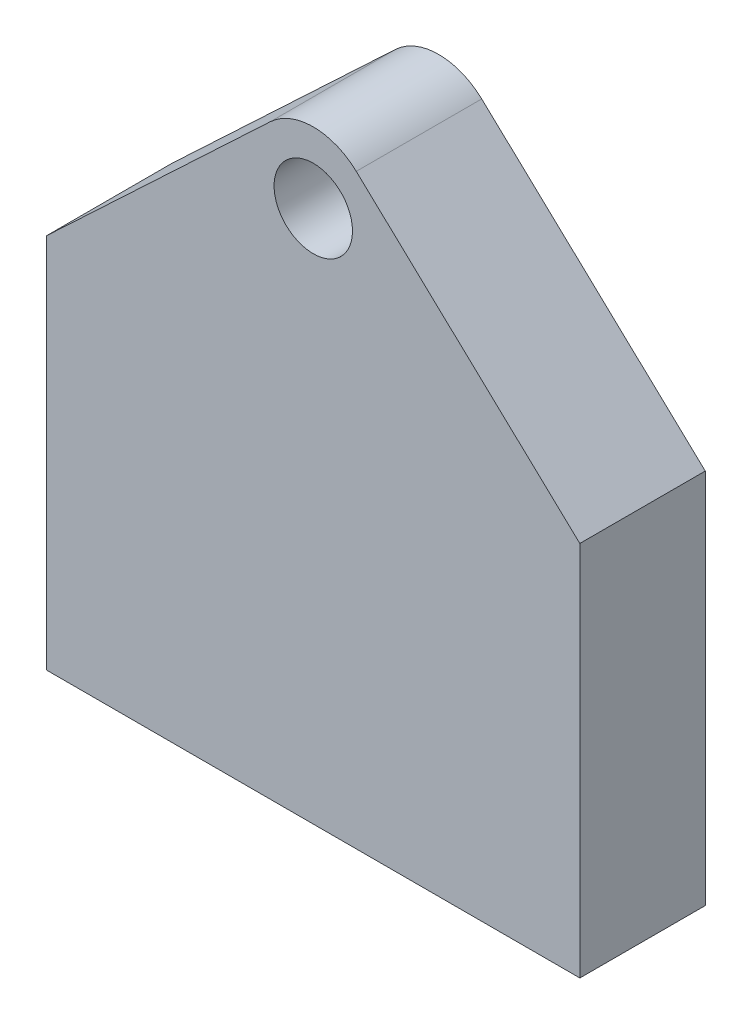
ISO-10303-21;
HEADER;
FILE_DESCRIPTION(('STEP AP214'),'2;1');
FILE_NAME('part.step','',(''),(''),'','','');
FILE_SCHEMA(('AUTOMOTIVE_DESIGN { 1 0 10303 214 1 1 1 1 }'));
ENDSEC;
DATA;
#1=APPLICATION_CONTEXT('core data for automotive mechanical design processes');
#2=APPLICATION_PROTOCOL_DEFINITION('international standard','automotive_design',2000,#1);
#3=PRODUCT_CONTEXT('',#1,'mechanical');
#4=PRODUCT('Part','Part','',(#3));
#5=PRODUCT_RELATED_PRODUCT_CATEGORY('part','',(#4));
#6=PRODUCT_DEFINITION_FORMATION('','',#4);
#7=PRODUCT_DEFINITION_CONTEXT('part definition',#1,'design');
#8=PRODUCT_DEFINITION('design','',#6,#7);
#9=PRODUCT_DEFINITION_SHAPE('','',#8);
#10=(LENGTH_UNIT() NAMED_UNIT(*) SI_UNIT(.MILLI.,.METRE.));
#11=(NAMED_UNIT(*) PLANE_ANGLE_UNIT() SI_UNIT($,.RADIAN.));
#12=(NAMED_UNIT(*) SI_UNIT($,.STERADIAN.) SOLID_ANGLE_UNIT());
#13=UNCERTAINTY_MEASURE_WITH_UNIT(LENGTH_MEASURE(1.E-05),#10,'distance_accuracy_value','');
#14=(GEOMETRIC_REPRESENTATION_CONTEXT(3) GLOBAL_UNCERTAINTY_ASSIGNED_CONTEXT((#13)) GLOBAL_UNIT_ASSIGNED_CONTEXT((#10,
#11,#12)) REPRESENTATION_CONTEXT('',''));
#15=CARTESIAN_POINT('',(0.,0.,0.));
#16=DIRECTION('',(0.,0.,1.));
#17=DIRECTION('',(1.,0.,0.));
#18=AXIS2_PLACEMENT_3D('',#15,#16,#17);
#19=CARTESIAN_POINT('',(-53.975,76.2,25.4));
#20=DIRECTION('',(1.,0.,0.));
#21=DIRECTION('',(0.,1.,0.));
#22=AXIS2_PLACEMENT_3D('',#19,#20,#21);
#23=PLANE('',#22);
#24=DIRECTION('',(0.,-1.,0.));
#25=VECTOR('',#24,1.);
#26=CARTESIAN_POINT('',(-53.975,76.2,0.));
#27=LINE('',#26,#25);
#28=CARTESIAN_POINT('',(-53.975,76.2,0.));
#29=VERTEX_POINT('',#28);
#30=CARTESIAN_POINT('',(-53.975,0.,0.));
#31=VERTEX_POINT('',#30);
#32=EDGE_CURVE('E112',#29,#31,#27,.T.);
#33=ORIENTED_EDGE('',*,*,#32,.T.);
#34=DIRECTION('',(0.,0.,-1.));
#35=VECTOR('',#34,1.);
#36=CARTESIAN_POINT('',(-53.975,0.,25.4));
#37=LINE('',#36,#35);
#38=CARTESIAN_POINT('',(-53.975,0.,25.4));
#39=VERTEX_POINT('',#38);
#40=EDGE_CURVE('E93',#39,#31,#37,.T.);
#41=ORIENTED_EDGE('',*,*,#40,.F.);
#42=DIRECTION('',(0.,-1.,0.));
#43=VECTOR('',#42,1.);
#44=CARTESIAN_POINT('',(-53.975,76.2,25.4));
#45=LINE('',#44,#43);
#46=CARTESIAN_POINT('',(-53.975,76.2,25.4));
#47=VERTEX_POINT('',#46);
#48=EDGE_CURVE('E100',#47,#39,#45,.T.);
#49=ORIENTED_EDGE('',*,*,#48,.F.);
#50=DIRECTION('',(0.,0.,-1.));
#51=VECTOR('',#50,1.);
#52=CARTESIAN_POINT('',(-53.975,76.2,25.4));
#53=LINE('',#52,#51);
#54=EDGE_CURVE('E123',#47,#29,#53,.T.);
#55=ORIENTED_EDGE('',*,*,#54,.T.);
#56=EDGE_LOOP('',(#33,#41,#49,#55));
#57=FACE_BOUND('',#56,.T.);
#58=ADVANCED_FACE('F36',(#57),#23,.F.);
#59=CARTESIAN_POINT('',(-53.975,0.,25.4));
#60=DIRECTION('',(0.,1.,0.));
#61=DIRECTION('',(0.,0.,1.));
#62=AXIS2_PLACEMENT_3D('',#59,#60,#61);
#63=PLANE('',#62);
#64=DIRECTION('',(1.,0.,0.));
#65=VECTOR('',#64,1.);
#66=CARTESIAN_POINT('',(-53.975,0.,0.));
#67=LINE('',#66,#65);
#68=CARTESIAN_POINT('',(53.975,0.,0.));
#69=VERTEX_POINT('',#68);
#70=EDGE_CURVE('E130',#31,#69,#67,.T.);
#71=ORIENTED_EDGE('',*,*,#70,.T.);
#72=DIRECTION('',(0.,0.,-1.));
#73=VECTOR('',#72,1.);
#74=CARTESIAN_POINT('',(53.975,0.,25.4));
#75=LINE('',#74,#73);
#76=CARTESIAN_POINT('',(53.975,0.,25.4));
#77=VERTEX_POINT('',#76);
#78=EDGE_CURVE('E96',#77,#69,#75,.T.);
#79=ORIENTED_EDGE('',*,*,#78,.F.);
#80=DIRECTION('',(1.,0.,0.));
#81=VECTOR('',#80,1.);
#82=CARTESIAN_POINT('',(-53.975,0.,25.4));
#83=LINE('',#82,#81);
#84=EDGE_CURVE('E89',#39,#77,#83,.T.);
#85=ORIENTED_EDGE('',*,*,#84,.F.);
#86=ORIENTED_EDGE('',*,*,#40,.T.);
#87=EDGE_LOOP('',(#71,#79,#85,#86));
#88=FACE_BOUND('',#87,.T.);
#89=ADVANCED_FACE('F91',(#88),#63,.F.);
#90=CARTESIAN_POINT('',(53.975,0.,25.4));
#91=DIRECTION('',(-1.,0.,0.));
#92=DIRECTION('',(0.,0.,1.));
#93=AXIS2_PLACEMENT_3D('',#90,#91,#92);
#94=PLANE('',#93);
#95=DIRECTION('',(0.,1.,0.));
#96=VECTOR('',#95,1.);
#97=CARTESIAN_POINT('',(53.975,0.,0.));
#98=LINE('',#97,#96);
#99=CARTESIAN_POINT('',(53.975,76.2,0.));
#100=VERTEX_POINT('',#99);
#101=EDGE_CURVE('E128',#69,#100,#98,.T.);
#102=ORIENTED_EDGE('',*,*,#101,.T.);
#103=DIRECTION('',(0.,0.,-1.));
#104=VECTOR('',#103,1.);
#105=CARTESIAN_POINT('',(53.975,76.2,25.4));
#106=LINE('',#105,#104);
#107=CARTESIAN_POINT('',(53.975,76.2,25.4));
#108=VERTEX_POINT('',#107);
#109=EDGE_CURVE('E117',#108,#100,#106,.T.);
#110=ORIENTED_EDGE('',*,*,#109,.F.);
#111=DIRECTION('',(0.,1.,0.));
#112=VECTOR('',#111,1.);
#113=CARTESIAN_POINT('',(53.975,0.,25.4));
#114=LINE('',#113,#112);
#115=EDGE_CURVE('E99',#77,#108,#114,.T.);
#116=ORIENTED_EDGE('',*,*,#115,.F.);
#117=ORIENTED_EDGE('',*,*,#78,.T.);
#118=EDGE_LOOP('',(#102,#110,#116,#117));
#119=FACE_BOUND('',#118,.T.);
#120=ADVANCED_FACE('F167',(#119),#94,.F.);
#121=CARTESIAN_POINT('',(53.975,76.2,25.4));
#122=DIRECTION('',(-0.685364699004991,-0.728199992692803,0.));
#123=DIRECTION('',(0.728199992692803,-0.685364699004991,0.));
#124=AXIS2_PLACEMENT_3D('',#121,#122,#123);
#125=PLANE('',#124);
#126=DIRECTION('',(-0.728199992692803,0.685364699004991,0.));
#127=VECTOR('',#126,1.);
#128=CARTESIAN_POINT('',(53.975,76.2,0.));
#129=LINE('',#128,#127);
#130=CARTESIAN_POINT('',(8.70413167736337,118.807876068364,0.));
#131=VERTEX_POINT('',#130);
#132=EDGE_CURVE('E126',#100,#131,#129,.T.);
#133=ORIENTED_EDGE('',*,*,#132,.T.);
#134=DIRECTION('',(0.,0.,-1.));
#135=VECTOR('',#134,1.);
#136=CARTESIAN_POINT('',(8.70413167736339,118.807876068364,25.4));
#137=LINE('',#136,#135);
#138=CARTESIAN_POINT('',(8.70413167736337,118.807876068364,25.4));
#139=VERTEX_POINT('',#138);
#140=EDGE_CURVE('E44',#131,#139,#137,.F.);
#141=ORIENTED_EDGE('',*,*,#140,.T.);
#142=DIRECTION('',(-0.728199992692803,0.685364699004991,0.));
#143=VECTOR('',#142,1.);
#144=CARTESIAN_POINT('',(53.975,76.2,25.4));
#145=LINE('',#144,#143);
#146=EDGE_CURVE('E135',#108,#139,#145,.T.);
#147=ORIENTED_EDGE('',*,*,#146,.F.);
#148=ORIENTED_EDGE('',*,*,#109,.T.);
#149=EDGE_LOOP('',(#133,#141,#147,#148));
#150=FACE_BOUND('',#149,.T.);
#151=ADVANCED_FACE('F160',(#150),#125,.F.);
#152=CARTESIAN_POINT('',(0.,127.,25.4));
#153=DIRECTION('',(0.685364699004991,-0.728199992692803,0.));
#154=DIRECTION('',(0.728199992692803,0.685364699004991,0.));
#155=AXIS2_PLACEMENT_3D('',#152,#153,#154);
#156=PLANE('',#155);
#157=DIRECTION('',(-0.728199992692803,-0.685364699004991,0.));
#158=VECTOR('',#157,1.);
#159=CARTESIAN_POINT('',(0.,127.,25.4));
#160=LINE('',#159,#158);
#161=CARTESIAN_POINT('',(-8.70413167736339,118.807876068364,25.4));
#162=VERTEX_POINT('',#161);
#163=EDGE_CURVE('E105',#162,#47,#160,.T.);
#164=ORIENTED_EDGE('',*,*,#163,.F.);
#165=DIRECTION('',(0.,0.,-1.));
#166=VECTOR('',#165,1.);
#167=CARTESIAN_POINT('',(-8.70413167736339,118.807876068364,25.4));
#168=LINE('',#167,#166);
#169=CARTESIAN_POINT('',(-8.70413167736339,118.807876068364,0.));
#170=VERTEX_POINT('',#169);
#171=EDGE_CURVE('E113',#162,#170,#168,.T.);
#172=ORIENTED_EDGE('',*,*,#171,.T.);
#173=DIRECTION('',(-0.728199992692803,-0.685364699004991,0.));
#174=VECTOR('',#173,1.);
#175=CARTESIAN_POINT('',(0.,127.,0.));
#176=LINE('',#175,#174);
#177=EDGE_CURVE('E109',#170,#29,#176,.T.);
#178=ORIENTED_EDGE('',*,*,#177,.T.);
#179=ORIENTED_EDGE('',*,*,#54,.F.);
#180=EDGE_LOOP('',(#164,#172,#178,#179));
#181=FACE_BOUND('',#180,.T.);
#182=ADVANCED_FACE('F153',(#181),#156,.F.);
#183=CARTESIAN_POINT('',(0.,0.,25.4));
#184=DIRECTION('',(0.,0.,1.));
#185=DIRECTION('',(1.,0.,0.));
#186=AXIS2_PLACEMENT_3D('',#183,#184,#185);
#187=PLANE('',#186);
#188=CARTESIAN_POINT('',(0.,107.950000000001,25.4));
#189=DIRECTION('',(0.,0.,1.));
#190=DIRECTION('',(1.,0.,0.));
#191=AXIS2_PLACEMENT_3D('',#188,#189,#190);
#192=CIRCLE('',#191,7.93750000000011);
#193=CARTESIAN_POINT('',(7.93750000000011,107.950000000001,25.4));
#194=VERTEX_POINT('',#193);
#195=EDGE_CURVE('E138',#194,#194,#192,.T.);
#196=ORIENTED_EDGE('',*,*,#195,.F.);
#197=EDGE_LOOP('',(#196));
#198=FACE_BOUND('',#197,.T.);
#199=ORIENTED_EDGE('',*,*,#146,.T.);
#200=CARTESIAN_POINT('',(0.,109.559736161165,25.4));
#201=DIRECTION('',(0.,0.,1.));
#202=DIRECTION('',(1.,0.,0.));
#203=AXIS2_PLACEMENT_3D('',#200,#201,#202);
#204=CIRCLE('',#203,12.7);
#205=EDGE_CURVE('E11',#139,#162,#204,.T.);
#206=ORIENTED_EDGE('',*,*,#205,.T.);
#207=ORIENTED_EDGE('',*,*,#163,.T.);
#208=ORIENTED_EDGE('',*,*,#48,.T.);
#209=ORIENTED_EDGE('',*,*,#84,.T.);
#210=ORIENTED_EDGE('',*,*,#115,.T.);
#211=EDGE_LOOP('',(#199,#206,#207,#208,#209,#210));
#212=FACE_BOUND('',#211,.T.);
#213=ADVANCED_FACE('F103',(#198,#212),#187,.T.);
#214=CARTESIAN_POINT('',(0.,0.,0.));
#215=DIRECTION('',(0.,0.,1.));
#216=DIRECTION('',(1.,0.,0.));
#217=AXIS2_PLACEMENT_3D('',#214,#215,#216);
#218=PLANE('',#217);
#219=CARTESIAN_POINT('',(0.,107.950000000001,0.));
#220=DIRECTION('',(0.,0.,1.));
#221=DIRECTION('',(1.,0.,0.));
#222=AXIS2_PLACEMENT_3D('',#219,#220,#221);
#223=CIRCLE('',#222,7.93750000000011);
#224=CARTESIAN_POINT('',(7.93750000000011,107.950000000001,0.));
#225=VERTEX_POINT('',#224);
#226=EDGE_CURVE('E133',#225,#225,#223,.T.);
#227=ORIENTED_EDGE('',*,*,#226,.T.);
#228=EDGE_LOOP('',(#227));
#229=FACE_BOUND('',#228,.T.);
#230=ORIENTED_EDGE('',*,*,#177,.F.);
#231=CARTESIAN_POINT('',(0.,109.559736161165,0.));
#232=DIRECTION('',(0.,0.,1.));
#233=DIRECTION('',(1.,0.,0.));
#234=AXIS2_PLACEMENT_3D('',#231,#232,#233);
#235=CIRCLE('',#234,12.7);
#236=EDGE_CURVE('E58',#170,#131,#235,.F.);
#237=ORIENTED_EDGE('',*,*,#236,.T.);
#238=ORIENTED_EDGE('',*,*,#132,.F.);
#239=ORIENTED_EDGE('',*,*,#101,.F.);
#240=ORIENTED_EDGE('',*,*,#70,.F.);
#241=ORIENTED_EDGE('',*,*,#32,.F.);
#242=EDGE_LOOP('',(#230,#237,#238,#239,#240,#241));
#243=FACE_BOUND('',#242,.T.);
#244=ADVANCED_FACE('F144',(#229,#243),#218,.F.);
#245=CARTESIAN_POINT('',(0.,109.559736161165,25.4));
#246=DIRECTION('',(0.,0.,-1.));
#247=DIRECTION('',(-1.,0.,0.));
#248=AXIS2_PLACEMENT_3D('',#245,#246,#247);
#249=CYLINDRICAL_SURFACE('',#248,12.7);
#250=ORIENTED_EDGE('',*,*,#205,.F.);
#251=ORIENTED_EDGE('',*,*,#140,.F.);
#252=ORIENTED_EDGE('',*,*,#236,.F.);
#253=ORIENTED_EDGE('',*,*,#171,.F.);
#254=EDGE_LOOP('',(#250,#251,#252,#253));
#255=FACE_BOUND('',#254,.T.);
#256=ADVANCED_FACE('F38',(#255),#249,.T.);
#257=CARTESIAN_POINT('',(0.,107.950000000001,0.));
#258=DIRECTION('',(0.,0.,1.));
#259=DIRECTION('',(1.,0.,0.));
#260=AXIS2_PLACEMENT_3D('',#257,#258,#259);
#261=CYLINDRICAL_SURFACE('',#260,7.93750000000011);
#262=ORIENTED_EDGE('',*,*,#226,.F.);
#263=EDGE_LOOP('',(#262));
#264=FACE_BOUND('',#263,.T.);
#265=ORIENTED_EDGE('',*,*,#195,.T.);
#266=EDGE_LOOP('',(#265));
#267=FACE_BOUND('',#266,.T.);
#268=ADVANCED_FACE('F146',(#264,#267),#261,.F.);
#269=CLOSED_SHELL('',(#58,#89,#120,#151,#182,#213,#244,#256,#268));
#270=MANIFOLD_SOLID_BREP('B2',#269);
#271=ADVANCED_BREP_SHAPE_REPRESENTATION('',(#18,#270),#14);
#272=SHAPE_DEFINITION_REPRESENTATION(#9,#271);
ENDSEC;
END-ISO-10303-21;
